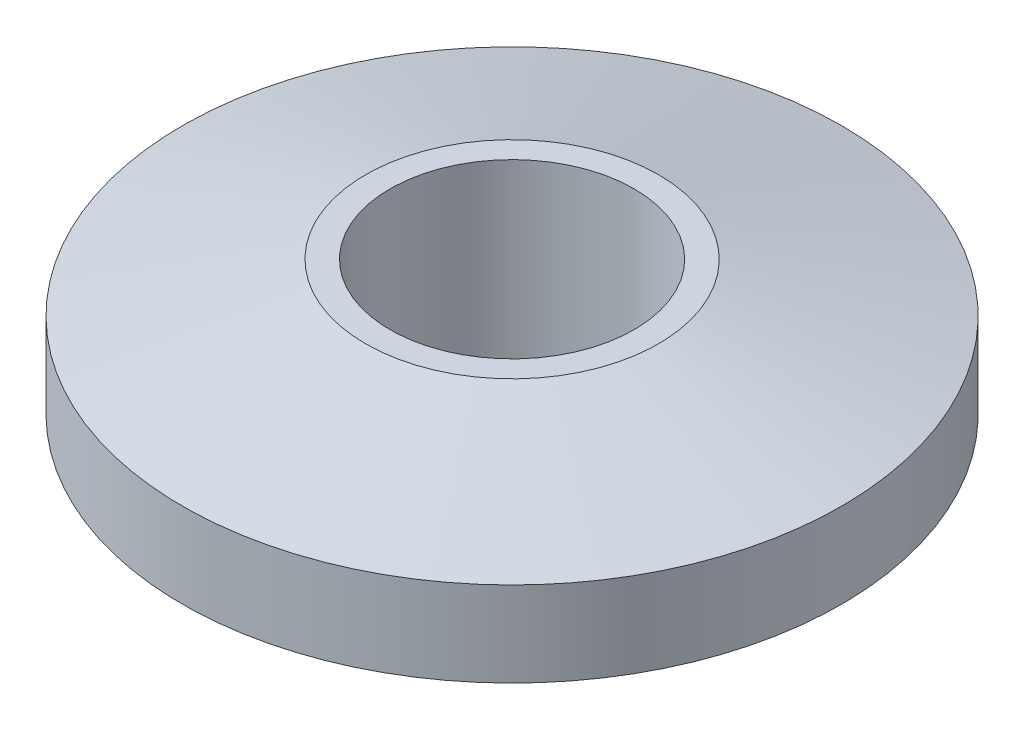
ISO-10303-21;
HEADER;
FILE_DESCRIPTION(('STEP AP214'),'2;1');
FILE_NAME('part.step','',(''),(''),'','','');
FILE_SCHEMA(('AUTOMOTIVE_DESIGN { 1 0 10303 214 1 1 1 1 }'));
ENDSEC;
DATA;
#1=APPLICATION_CONTEXT('core data for automotive mechanical design processes');
#2=APPLICATION_PROTOCOL_DEFINITION('international standard','automotive_design',2000,#1);
#3=PRODUCT_CONTEXT('',#1,'mechanical');
#4=PRODUCT('Part','Part','',(#3));
#5=PRODUCT_RELATED_PRODUCT_CATEGORY('part','',(#4));
#6=PRODUCT_DEFINITION_FORMATION('','',#4);
#7=PRODUCT_DEFINITION_CONTEXT('part definition',#1,'design');
#8=PRODUCT_DEFINITION('design','',#6,#7);
#9=PRODUCT_DEFINITION_SHAPE('','',#8);
#10=(LENGTH_UNIT() NAMED_UNIT(*) SI_UNIT(.MILLI.,.METRE.));
#11=(NAMED_UNIT(*) PLANE_ANGLE_UNIT() SI_UNIT($,.RADIAN.));
#12=(NAMED_UNIT(*) SI_UNIT($,.STERADIAN.) SOLID_ANGLE_UNIT());
#13=UNCERTAINTY_MEASURE_WITH_UNIT(LENGTH_MEASURE(1.E-05),#10,'distance_accuracy_value','');
#14=(GEOMETRIC_REPRESENTATION_CONTEXT(3) GLOBAL_UNCERTAINTY_ASSIGNED_CONTEXT((#13)) GLOBAL_UNIT_ASSIGNED_CONTEXT((#10,
#11,#12)) REPRESENTATION_CONTEXT('',''));
#15=CARTESIAN_POINT('',(0.,0.,0.));
#16=DIRECTION('',(0.,0.,1.));
#17=DIRECTION('',(1.,0.,0.));
#18=AXIS2_PLACEMENT_3D('',#15,#16,#17);
#19=CARTESIAN_POINT('',(0.,3.75,0.));
#20=DIRECTION('',(0.,-1.,0.));
#21=DIRECTION('',(0.,0.,-1.));
#22=AXIS2_PLACEMENT_3D('',#19,#20,#21);
#23=CONICAL_SURFACE('',#22,6.,1.30899693899575);
#24=CARTESIAN_POINT('',(0.,1.74038105676657,0.));
#25=DIRECTION('',(0.,-1.,0.));
#26=DIRECTION('',(0.,0.,-1.));
#27=AXIS2_PLACEMENT_3D('',#24,#25,#26);
#28=CIRCLE('',#27,13.5);
#29=CARTESIAN_POINT('',(0.,1.74038105676657,-13.5));
#30=VERTEX_POINT('',#29);
#31=EDGE_CURVE('E59',#30,#30,#28,.T.);
#32=ORIENTED_EDGE('',*,*,#31,.F.);
#33=EDGE_LOOP('',(#32));
#34=FACE_BOUND('',#33,.T.);
#35=CARTESIAN_POINT('',(0.,3.75,0.));
#36=DIRECTION('',(0.,-1.,0.));
#37=DIRECTION('',(0.,0.,-1.));
#38=AXIS2_PLACEMENT_3D('',#35,#36,#37);
#39=CIRCLE('',#38,6.);
#40=CARTESIAN_POINT('',(0.,3.75,-6.));
#41=VERTEX_POINT('',#40);
#42=EDGE_CURVE('E10',#41,#41,#39,.T.);
#43=ORIENTED_EDGE('',*,*,#42,.T.);
#44=EDGE_LOOP('',(#43));
#45=FACE_BOUND('',#44,.T.);
#46=ADVANCED_FACE('F37',(#34,#45),#23,.T.);
#47=CARTESIAN_POINT('',(-6.,3.75,0.));
#48=DIRECTION('',(0.,-1.,0.));
#49=DIRECTION('',(0.,0.,-1.));
#50=AXIS2_PLACEMENT_3D('',#47,#48,#49);
#51=PLANE('',#50);
#52=ORIENTED_EDGE('',*,*,#42,.F.);
#53=EDGE_LOOP('',(#52));
#54=FACE_BOUND('',#53,.T.);
#55=CARTESIAN_POINT('',(0.,3.75,0.));
#56=DIRECTION('',(0.,-1.,0.));
#57=DIRECTION('',(0.,0.,-1.));
#58=AXIS2_PLACEMENT_3D('',#55,#56,#57);
#59=CIRCLE('',#58,5.);
#60=CARTESIAN_POINT('',(0.,3.75,-5.));
#61=VERTEX_POINT('',#60);
#62=EDGE_CURVE('E43',#61,#61,#59,.T.);
#63=ORIENTED_EDGE('',*,*,#62,.T.);
#64=EDGE_LOOP('',(#63));
#65=FACE_BOUND('',#64,.T.);
#66=ADVANCED_FACE('F66',(#54,#65),#51,.F.);
#67=CARTESIAN_POINT('',(0.,0.,0.));
#68=DIRECTION('',(0.,-1.,0.));
#69=DIRECTION('',(0.,0.,-1.));
#70=AXIS2_PLACEMENT_3D('',#67,#68,#69);
#71=CYLINDRICAL_SURFACE('',#70,5.);
#72=ORIENTED_EDGE('',*,*,#62,.F.);
#73=EDGE_LOOP('',(#72));
#74=FACE_BOUND('',#73,.T.);
#75=CARTESIAN_POINT('',(0.,-3.75,0.));
#76=DIRECTION('',(0.,-1.,0.));
#77=DIRECTION('',(0.,0.,-1.));
#78=AXIS2_PLACEMENT_3D('',#75,#76,#77);
#79=CIRCLE('',#78,5.);
#80=CARTESIAN_POINT('',(0.,-3.75,-5.));
#81=VERTEX_POINT('',#80);
#82=EDGE_CURVE('E47',#81,#81,#79,.T.);
#83=ORIENTED_EDGE('',*,*,#82,.T.);
#84=EDGE_LOOP('',(#83));
#85=FACE_BOUND('',#84,.T.);
#86=ADVANCED_FACE('F70',(#74,#85),#71,.F.);
#87=CARTESIAN_POINT('',(-5.,-3.75,0.));
#88=DIRECTION('',(0.,1.,0.));
#89=DIRECTION('',(0.,0.,1.));
#90=AXIS2_PLACEMENT_3D('',#87,#88,#89);
#91=PLANE('',#90);
#92=ORIENTED_EDGE('',*,*,#82,.F.);
#93=EDGE_LOOP('',(#92));
#94=FACE_BOUND('',#93,.T.);
#95=CARTESIAN_POINT('',(0.,-3.75,0.));
#96=DIRECTION('',(0.,-1.,0.));
#97=DIRECTION('',(0.,0.,-1.));
#98=AXIS2_PLACEMENT_3D('',#95,#96,#97);
#99=CIRCLE('',#98,6.);
#100=CARTESIAN_POINT('',(0.,-3.75,-6.));
#101=VERTEX_POINT('',#100);
#102=EDGE_CURVE('E51',#101,#101,#99,.T.);
#103=ORIENTED_EDGE('',*,*,#102,.T.);
#104=EDGE_LOOP('',(#103));
#105=FACE_BOUND('',#104,.T.);
#106=ADVANCED_FACE('F75',(#94,#105),#91,.F.);
#107=CARTESIAN_POINT('',(0.,-1.74038105676657,0.));
#108=DIRECTION('',(0.,1.,0.));
#109=DIRECTION('',(0.,0.,1.));
#110=AXIS2_PLACEMENT_3D('',#107,#108,#109);
#111=CONICAL_SURFACE('',#110,13.5,1.30899693899575);
#112=ORIENTED_EDGE('',*,*,#102,.F.);
#113=EDGE_LOOP('',(#112));
#114=FACE_BOUND('',#113,.T.);
#115=CARTESIAN_POINT('',(0.,-1.74038105676657,0.));
#116=DIRECTION('',(0.,-1.,0.));
#117=DIRECTION('',(0.,0.,-1.));
#118=AXIS2_PLACEMENT_3D('',#115,#116,#117);
#119=CIRCLE('',#118,13.5);
#120=CARTESIAN_POINT('',(0.,-1.74038105676657,-13.5));
#121=VERTEX_POINT('',#120);
#122=EDGE_CURVE('E56',#121,#121,#119,.T.);
#123=ORIENTED_EDGE('',*,*,#122,.T.);
#124=EDGE_LOOP('',(#123));
#125=FACE_BOUND('',#124,.T.);
#126=ADVANCED_FACE('F81',(#114,#125),#111,.T.);
#127=CARTESIAN_POINT('',(0.,0.,0.));
#128=DIRECTION('',(0.,-1.,0.));
#129=DIRECTION('',(0.,0.,-1.));
#130=AXIS2_PLACEMENT_3D('',#127,#128,#129);
#131=CYLINDRICAL_SURFACE('',#130,13.5);
#132=ORIENTED_EDGE('',*,*,#122,.F.);
#133=EDGE_LOOP('',(#132));
#134=FACE_BOUND('',#133,.T.);
#135=ORIENTED_EDGE('',*,*,#31,.T.);
#136=EDGE_LOOP('',(#135));
#137=FACE_BOUND('',#136,.T.);
#138=ADVANCED_FACE('F63',(#134,#137),#131,.T.);
#139=CLOSED_SHELL('',(#46,#66,#86,#106,#126,#138));
#140=MANIFOLD_SOLID_BREP('B2',#139);
#141=ADVANCED_BREP_SHAPE_REPRESENTATION('',(#18,#140),#14);
#142=SHAPE_DEFINITION_REPRESENTATION(#9,#141);
ENDSEC;
END-ISO-10303-21;
